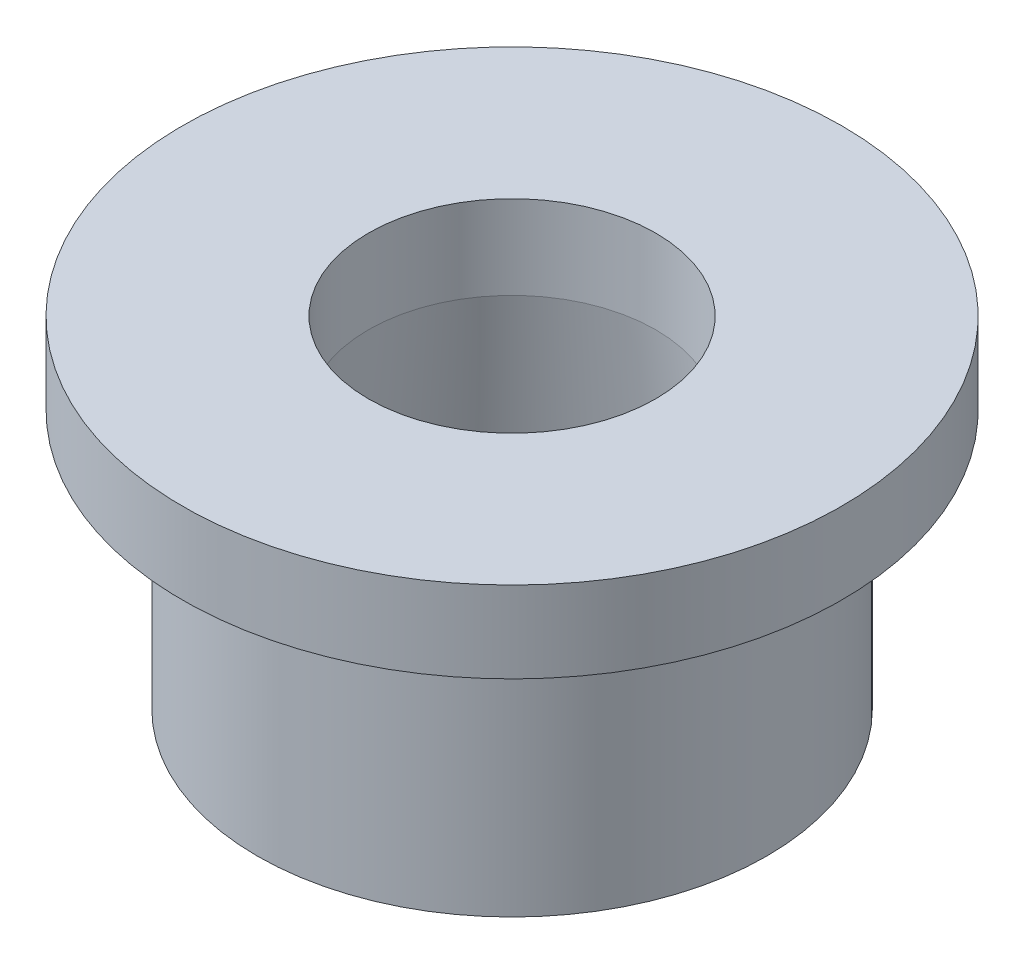
ISO-10303-21;
HEADER;
FILE_DESCRIPTION(('STEP AP214'),'2;1');
FILE_NAME('part.step','',(''),(''),'','','');
FILE_SCHEMA(('AUTOMOTIVE_DESIGN { 1 0 10303 214 1 1 1 1 }'));
ENDSEC;
DATA;
#1=APPLICATION_CONTEXT('core data for automotive mechanical design processes');
#2=APPLICATION_PROTOCOL_DEFINITION('international standard','automotive_design',2000,#1);
#3=PRODUCT_CONTEXT('',#1,'mechanical');
#4=PRODUCT('Part','Part','',(#3));
#5=PRODUCT_RELATED_PRODUCT_CATEGORY('part','',(#4));
#6=PRODUCT_DEFINITION_FORMATION('','',#4);
#7=PRODUCT_DEFINITION_CONTEXT('part definition',#1,'design');
#8=PRODUCT_DEFINITION('design','',#6,#7);
#9=PRODUCT_DEFINITION_SHAPE('','',#8);
#10=(LENGTH_UNIT() NAMED_UNIT(*) SI_UNIT(.MILLI.,.METRE.));
#11=(NAMED_UNIT(*) PLANE_ANGLE_UNIT() SI_UNIT($,.RADIAN.));
#12=(NAMED_UNIT(*) SI_UNIT($,.STERADIAN.) SOLID_ANGLE_UNIT());
#13=UNCERTAINTY_MEASURE_WITH_UNIT(LENGTH_MEASURE(1.E-05),#10,'distance_accuracy_value','');
#14=(GEOMETRIC_REPRESENTATION_CONTEXT(3) GLOBAL_UNCERTAINTY_ASSIGNED_CONTEXT((#13)) GLOBAL_UNIT_ASSIGNED_CONTEXT((#10,
#11,#12)) REPRESENTATION_CONTEXT('',''));
#15=CARTESIAN_POINT('',(0.,0.,0.));
#16=DIRECTION('',(0.,0.,1.));
#17=DIRECTION('',(1.,0.,0.));
#18=AXIS2_PLACEMENT_3D('',#15,#16,#17);
#19=CARTESIAN_POINT('',(7.7216,7.9756,0.));
#20=DIRECTION('',(0.,1.,0.));
#21=DIRECTION('',(0.,0.,1.));
#22=AXIS2_PLACEMENT_3D('',#19,#20,#21);
#23=PLANE('',#22);
#24=CARTESIAN_POINT('',(0.,7.9756,0.));
#25=DIRECTION('',(0.,-1.,0.));
#26=DIRECTION('',(0.,0.,-1.));
#27=AXIS2_PLACEMENT_3D('',#24,#25,#26);
#28=CIRCLE('',#27,3.3655);
#29=CARTESIAN_POINT('',(0.,7.9756,-3.3655));
#30=VERTEX_POINT('',#29);
#31=EDGE_CURVE('E10',#30,#30,#28,.T.);
#32=ORIENTED_EDGE('',*,*,#31,.T.);
#33=EDGE_LOOP('',(#32));
#34=FACE_BOUND('',#33,.T.);
#35=CARTESIAN_POINT('',(0.,7.9756,0.));
#36=DIRECTION('',(0.,-1.,0.));
#37=DIRECTION('',(0.,0.,-1.));
#38=AXIS2_PLACEMENT_3D('',#35,#36,#37);
#39=CIRCLE('',#38,7.7216);
#40=CARTESIAN_POINT('',(0.,7.9756,-7.7216));
#41=VERTEX_POINT('',#40);
#42=EDGE_CURVE('E56',#41,#41,#39,.T.);
#43=ORIENTED_EDGE('',*,*,#42,.F.);
#44=EDGE_LOOP('',(#43));
#45=FACE_BOUND('',#44,.T.);
#46=ADVANCED_FACE('F31',(#34,#45),#23,.T.);
#47=CARTESIAN_POINT('',(0.,0.,0.));
#48=DIRECTION('',(0.,-1.,0.));
#49=DIRECTION('',(0.,0.,-1.));
#50=AXIS2_PLACEMENT_3D('',#47,#48,#49);
#51=CYLINDRICAL_SURFACE('',#50,3.3655);
#52=CARTESIAN_POINT('',(0.,6.01380814781923,0.));
#53=DIRECTION('',(0.,-1.,0.));
#54=DIRECTION('',(0.,0.,-1.));
#55=AXIS2_PLACEMENT_3D('',#52,#53,#54);
#56=CIRCLE('',#55,3.3655);
#57=CARTESIAN_POINT('',(0.,6.01380814781923,-3.3655));
#58=VERTEX_POINT('',#57);
#59=EDGE_CURVE('E37',#58,#58,#56,.T.);
#60=ORIENTED_EDGE('',*,*,#59,.T.);
#61=EDGE_LOOP('',(#60));
#62=FACE_BOUND('',#61,.T.);
#63=ORIENTED_EDGE('',*,*,#31,.F.);
#64=EDGE_LOOP('',(#63));
#65=FACE_BOUND('',#64,.T.);
#66=ADVANCED_FACE('F64',(#62,#65),#51,.F.);
#67=CARTESIAN_POINT('',(0.,6.01380814781923,0.));
#68=DIRECTION('',(0.,-1.,0.));
#69=DIRECTION('',(0.,0.,-1.));
#70=AXIS2_PLACEMENT_3D('',#67,#68,#69);
#71=CONICAL_SURFACE('',#70,3.3655,0.11563124176302);
#72=CARTESIAN_POINT('',(0.,0.,0.));
#73=DIRECTION('',(0.,-1.,0.));
#74=DIRECTION('',(0.,0.,-1.));
#75=AXIS2_PLACEMENT_3D('',#72,#73,#74);
#76=CIRCLE('',#75,4.064);
#77=CARTESIAN_POINT('',(0.,0.,-4.064));
#78=VERTEX_POINT('',#77);
#79=EDGE_CURVE('E41',#78,#78,#76,.T.);
#80=ORIENTED_EDGE('',*,*,#79,.T.);
#81=EDGE_LOOP('',(#80));
#82=FACE_BOUND('',#81,.T.);
#83=ORIENTED_EDGE('',*,*,#59,.F.);
#84=EDGE_LOOP('',(#83));
#85=FACE_BOUND('',#84,.T.);
#86=ADVANCED_FACE('F68',(#82,#85),#71,.F.);
#87=CARTESIAN_POINT('',(4.064,0.,0.));
#88=DIRECTION('',(0.,-1.,0.));
#89=DIRECTION('',(0.,0.,-1.));
#90=AXIS2_PLACEMENT_3D('',#87,#88,#89);
#91=PLANE('',#90);
#92=CARTESIAN_POINT('',(0.,0.,0.));
#93=DIRECTION('',(0.,-1.,0.));
#94=DIRECTION('',(0.,0.,-1.));
#95=AXIS2_PLACEMENT_3D('',#92,#93,#94);
#96=CIRCLE('',#95,5.969);
#97=CARTESIAN_POINT('',(0.,0.,-5.969));
#98=VERTEX_POINT('',#97);
#99=EDGE_CURVE('E45',#98,#98,#96,.T.);
#100=ORIENTED_EDGE('',*,*,#99,.T.);
#101=EDGE_LOOP('',(#100));
#102=FACE_BOUND('',#101,.T.);
#103=ORIENTED_EDGE('',*,*,#79,.F.);
#104=EDGE_LOOP('',(#103));
#105=FACE_BOUND('',#104,.T.);
#106=ADVANCED_FACE('F72',(#102,#105),#91,.T.);
#107=CARTESIAN_POINT('',(0.,0.,0.));
#108=DIRECTION('',(0.,-1.,0.));
#109=DIRECTION('',(0.,0.,-1.));
#110=AXIS2_PLACEMENT_3D('',#107,#108,#109);
#111=CYLINDRICAL_SURFACE('',#110,5.969);
#112=CARTESIAN_POINT('',(0.,4.9784,0.));
#113=DIRECTION('',(0.,-1.,0.));
#114=DIRECTION('',(0.,0.,-1.));
#115=AXIS2_PLACEMENT_3D('',#112,#113,#114);
#116=CIRCLE('',#115,5.969);
#117=CARTESIAN_POINT('',(0.,4.9784,-5.969));
#118=VERTEX_POINT('',#117);
#119=EDGE_CURVE('E50',#118,#118,#116,.T.);
#120=ORIENTED_EDGE('',*,*,#119,.T.);
#121=EDGE_LOOP('',(#120));
#122=FACE_BOUND('',#121,.T.);
#123=ORIENTED_EDGE('',*,*,#99,.F.);
#124=EDGE_LOOP('',(#123));
#125=FACE_BOUND('',#124,.T.);
#126=ADVANCED_FACE('F79',(#122,#125),#111,.T.);
#127=CARTESIAN_POINT('',(0.,4.9784,0.));
#128=DIRECTION('',(0.,1.,0.));
#129=DIRECTION('',(0.,0.,1.));
#130=AXIS2_PLACEMENT_3D('',#127,#128,#129);
#131=CONICAL_SURFACE('',#130,5.969,1.01350079167739);
#132=CARTESIAN_POINT('',(0.,6.0706,0.));
#133=DIRECTION('',(0.,-1.,0.));
#134=DIRECTION('',(0.,0.,-1.));
#135=AXIS2_PLACEMENT_3D('',#132,#133,#134);
#136=CIRCLE('',#135,7.7216);
#137=CARTESIAN_POINT('',(0.,6.0706,-7.7216));
#138=VERTEX_POINT('',#137);
#139=EDGE_CURVE('E53',#138,#138,#136,.T.);
#140=ORIENTED_EDGE('',*,*,#139,.T.);
#141=EDGE_LOOP('',(#140));
#142=FACE_BOUND('',#141,.T.);
#143=ORIENTED_EDGE('',*,*,#119,.F.);
#144=EDGE_LOOP('',(#143));
#145=FACE_BOUND('',#144,.T.);
#146=ADVANCED_FACE('F83',(#142,#145),#131,.T.);
#147=CARTESIAN_POINT('',(0.,0.,0.));
#148=DIRECTION('',(0.,-1.,0.));
#149=DIRECTION('',(0.,0.,-1.));
#150=AXIS2_PLACEMENT_3D('',#147,#148,#149);
#151=CYLINDRICAL_SURFACE('',#150,7.7216);
#152=ORIENTED_EDGE('',*,*,#42,.T.);
#153=EDGE_LOOP('',(#152));
#154=FACE_BOUND('',#153,.T.);
#155=ORIENTED_EDGE('',*,*,#139,.F.);
#156=EDGE_LOOP('',(#155));
#157=FACE_BOUND('',#156,.T.);
#158=ADVANCED_FACE('F60',(#154,#157),#151,.T.);
#159=CLOSED_SHELL('',(#46,#66,#86,#106,#126,#146,#158));
#160=MANIFOLD_SOLID_BREP('B2',#159);
#161=ADVANCED_BREP_SHAPE_REPRESENTATION('',(#18,#160),#14);
#162=SHAPE_DEFINITION_REPRESENTATION(#9,#161);
ENDSEC;
END-ISO-10303-21;
